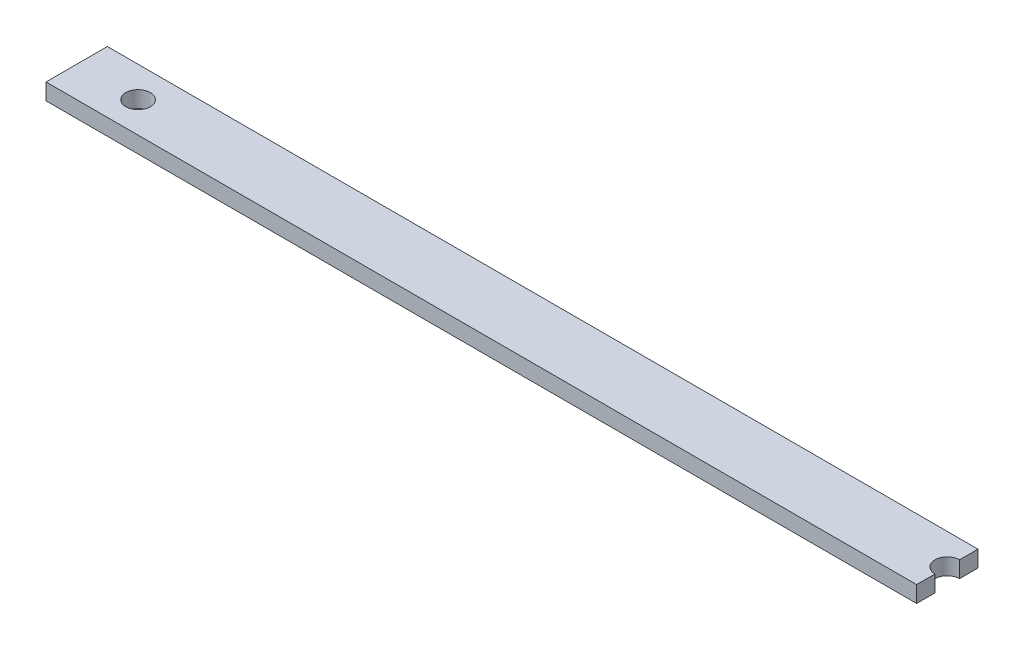
ISO-10303-21;
HEADER;
FILE_DESCRIPTION(('STEP AP214'),'2;1');
FILE_NAME('part.step','',(''),(''),'','','');
FILE_SCHEMA(('AUTOMOTIVE_DESIGN { 1 0 10303 214 1 1 1 1 }'));
ENDSEC;
DATA;
#1=APPLICATION_CONTEXT('core data for automotive mechanical design processes');
#2=APPLICATION_PROTOCOL_DEFINITION('international standard','automotive_design',2000,#1);
#3=PRODUCT_CONTEXT('',#1,'mechanical');
#4=PRODUCT('Part','Part','',(#3));
#5=PRODUCT_RELATED_PRODUCT_CATEGORY('part','',(#4));
#6=PRODUCT_DEFINITION_FORMATION('','',#4);
#7=PRODUCT_DEFINITION_CONTEXT('part definition',#1,'design');
#8=PRODUCT_DEFINITION('design','',#6,#7);
#9=PRODUCT_DEFINITION_SHAPE('','',#8);
#10=(LENGTH_UNIT() NAMED_UNIT(*) SI_UNIT(.MILLI.,.METRE.));
#11=(NAMED_UNIT(*) PLANE_ANGLE_UNIT() SI_UNIT($,.RADIAN.));
#12=(NAMED_UNIT(*) SI_UNIT($,.STERADIAN.) SOLID_ANGLE_UNIT());
#13=UNCERTAINTY_MEASURE_WITH_UNIT(LENGTH_MEASURE(1.E-05),#10,'distance_accuracy_value','');
#14=(GEOMETRIC_REPRESENTATION_CONTEXT(3) GLOBAL_UNCERTAINTY_ASSIGNED_CONTEXT((#13)) GLOBAL_UNIT_ASSIGNED_CONTEXT((#10,
#11,#12)) REPRESENTATION_CONTEXT('',''));
#15=CARTESIAN_POINT('',(0.,0.,0.));
#16=DIRECTION('',(0.,0.,1.));
#17=DIRECTION('',(1.,0.,0.));
#18=AXIS2_PLACEMENT_3D('',#15,#16,#17);
#19=CARTESIAN_POINT('',(106.37500000675,4.,7.5));
#20=DIRECTION('',(-1.,0.,0.));
#21=DIRECTION('',(0.,0.,1.));
#22=AXIS2_PLACEMENT_3D('',#19,#20,#21);
#23=PLANE('',#22);
#24=DIRECTION('',(0.,0.,-1.));
#25=VECTOR('',#24,1.);
#26=CARTESIAN_POINT('',(106.37500000675,0.,7.5));
#27=LINE('',#26,#25);
#28=CARTESIAN_POINT('',(106.37500000675,0.,7.5));
#29=VERTEX_POINT('',#28);
#30=CARTESIAN_POINT('',(106.37500000675,0.,3.00000000000001));
#31=VERTEX_POINT('',#30);
#32=EDGE_CURVE('E120',#29,#31,#27,.T.);
#33=ORIENTED_EDGE('',*,*,#32,.T.);
#34=DIRECTION('',(0.,1.,0.));
#35=VECTOR('',#34,1.);
#36=CARTESIAN_POINT('',(106.37500000675,0.,3.00000000000001));
#37=LINE('',#36,#35);
#38=CARTESIAN_POINT('',(106.37500000675,4.,3.00000000000001));
#39=VERTEX_POINT('',#38);
#40=EDGE_CURVE('E56',#31,#39,#37,.T.);
#41=ORIENTED_EDGE('',*,*,#40,.T.);
#42=DIRECTION('',(0.,0.,-1.));
#43=VECTOR('',#42,1.);
#44=CARTESIAN_POINT('',(106.37500000675,4.,7.5));
#45=LINE('',#44,#43);
#46=CARTESIAN_POINT('',(106.37500000675,4.,7.5));
#47=VERTEX_POINT('',#46);
#48=EDGE_CURVE('E155',#47,#39,#45,.T.);
#49=ORIENTED_EDGE('',*,*,#48,.F.);
#50=DIRECTION('',(0.,-1.,0.));
#51=VECTOR('',#50,1.);
#52=CARTESIAN_POINT('',(106.37500000675,4.,7.5));
#53=LINE('',#52,#51);
#54=EDGE_CURVE('E137',#47,#29,#53,.T.);
#55=ORIENTED_EDGE('',*,*,#54,.T.);
#56=EDGE_LOOP('',(#33,#41,#49,#55));
#57=FACE_BOUND('',#56,.T.);
#58=ADVANCED_FACE('F41',(#57),#23,.F.);
#59=CARTESIAN_POINT('',(106.37500000675,4.,-3.00000000000001));
#60=VERTEX_POINT('',#59);
#61=CARTESIAN_POINT('',(106.37500000675,4.,-7.5));
#62=VERTEX_POINT('',#61);
#63=EDGE_CURVE('E93',#60,#62,#45,.T.);
#64=ORIENTED_EDGE('',*,*,#63,.F.);
#65=DIRECTION('',(0.,1.,0.));
#66=VECTOR('',#65,1.);
#67=CARTESIAN_POINT('',(106.37500000675,0.,-3.00000000000001));
#68=LINE('',#67,#66);
#69=CARTESIAN_POINT('',(106.37500000675,0.,-3.00000000000001));
#70=VERTEX_POINT('',#69);
#71=EDGE_CURVE('E103',#60,#70,#68,.F.);
#72=ORIENTED_EDGE('',*,*,#71,.T.);
#73=CARTESIAN_POINT('',(106.37500000675,0.,-7.5));
#74=VERTEX_POINT('',#73);
#75=EDGE_CURVE('E110',#70,#74,#27,.T.);
#76=ORIENTED_EDGE('',*,*,#75,.T.);
#77=DIRECTION('',(0.,-1.,0.));
#78=VECTOR('',#77,1.);
#79=CARTESIAN_POINT('',(106.37500000675,4.,-7.5));
#80=LINE('',#79,#78);
#81=EDGE_CURVE('E50',#62,#74,#80,.T.);
#82=ORIENTED_EDGE('',*,*,#81,.F.);
#83=EDGE_LOOP('',(#64,#72,#76,#82));
#84=FACE_BOUND('',#83,.T.);
#85=ADVANCED_FACE('F43',(#84),#23,.F.);
#86=CARTESIAN_POINT('',(-106.37500000675,4.,-7.5));
#87=DIRECTION('',(0.,0.,1.));
#88=DIRECTION('',(1.,0.,0.));
#89=AXIS2_PLACEMENT_3D('',#86,#87,#88);
#90=PLANE('',#89);
#91=DIRECTION('',(-1.,0.,0.));
#92=VECTOR('',#91,1.);
#93=CARTESIAN_POINT('',(-106.37500000675,0.,-7.5));
#94=LINE('',#93,#92);
#95=CARTESIAN_POINT('',(-106.37500000675,0.,-7.5));
#96=VERTEX_POINT('',#95);
#97=EDGE_CURVE('E117',#74,#96,#94,.T.);
#98=ORIENTED_EDGE('',*,*,#97,.T.);
#99=DIRECTION('',(0.,-1.,0.));
#100=VECTOR('',#99,1.);
#101=CARTESIAN_POINT('',(-106.37500000675,4.,-7.5));
#102=LINE('',#101,#100);
#103=CARTESIAN_POINT('',(-106.37500000675,4.,-7.5));
#104=VERTEX_POINT('',#103);
#105=EDGE_CURVE('E143',#104,#96,#102,.T.);
#106=ORIENTED_EDGE('',*,*,#105,.F.);
#107=DIRECTION('',(-1.,0.,0.));
#108=VECTOR('',#107,1.);
#109=CARTESIAN_POINT('',(-106.37500000675,4.,-7.5));
#110=LINE('',#109,#108);
#111=EDGE_CURVE('E151',#62,#104,#110,.T.);
#112=ORIENTED_EDGE('',*,*,#111,.F.);
#113=ORIENTED_EDGE('',*,*,#81,.T.);
#114=EDGE_LOOP('',(#98,#106,#112,#113));
#115=FACE_BOUND('',#114,.T.);
#116=ADVANCED_FACE('F149',(#115),#90,.F.);
#117=CARTESIAN_POINT('',(-106.37500000675,4.,7.5));
#118=DIRECTION('',(1.,0.,0.));
#119=DIRECTION('',(0.,0.,-1.));
#120=AXIS2_PLACEMENT_3D('',#117,#118,#119);
#121=PLANE('',#120);
#122=DIRECTION('',(0.,0.,1.));
#123=VECTOR('',#122,1.);
#124=CARTESIAN_POINT('',(-106.37500000675,0.,7.5));
#125=LINE('',#124,#123);
#126=CARTESIAN_POINT('',(-106.37500000675,0.,7.5));
#127=VERTEX_POINT('',#126);
#128=EDGE_CURVE('E132',#96,#127,#125,.T.);
#129=ORIENTED_EDGE('',*,*,#128,.T.);
#130=DIRECTION('',(0.,-1.,0.));
#131=VECTOR('',#130,1.);
#132=CARTESIAN_POINT('',(-106.37500000675,4.,7.5));
#133=LINE('',#132,#131);
#134=CARTESIAN_POINT('',(-106.37500000675,4.,7.5));
#135=VERTEX_POINT('',#134);
#136=EDGE_CURVE('E140',#135,#127,#133,.T.);
#137=ORIENTED_EDGE('',*,*,#136,.F.);
#138=DIRECTION('',(0.,0.,1.));
#139=VECTOR('',#138,1.);
#140=CARTESIAN_POINT('',(-106.37500000675,4.,7.5));
#141=LINE('',#140,#139);
#142=EDGE_CURVE('E154',#104,#135,#141,.T.);
#143=ORIENTED_EDGE('',*,*,#142,.F.);
#144=ORIENTED_EDGE('',*,*,#105,.T.);
#145=EDGE_LOOP('',(#129,#137,#143,#144));
#146=FACE_BOUND('',#145,.T.);
#147=ADVANCED_FACE('F189',(#146),#121,.F.);
#148=CARTESIAN_POINT('',(-106.37500000675,4.,7.5));
#149=DIRECTION('',(0.,0.,-1.));
#150=DIRECTION('',(-1.,0.,0.));
#151=AXIS2_PLACEMENT_3D('',#148,#149,#150);
#152=PLANE('',#151);
#153=DIRECTION('',(1.,0.,0.));
#154=VECTOR('',#153,1.);
#155=CARTESIAN_POINT('',(-106.37500000675,0.,7.5));
#156=LINE('',#155,#154);
#157=EDGE_CURVE('E86',#127,#29,#156,.T.);
#158=ORIENTED_EDGE('',*,*,#157,.T.);
#159=ORIENTED_EDGE('',*,*,#54,.F.);
#160=DIRECTION('',(1.,0.,0.));
#161=VECTOR('',#160,1.);
#162=CARTESIAN_POINT('',(-106.37500000675,4.,7.5));
#163=LINE('',#162,#161);
#164=EDGE_CURVE('E65',#135,#47,#163,.T.);
#165=ORIENTED_EDGE('',*,*,#164,.F.);
#166=ORIENTED_EDGE('',*,*,#136,.T.);
#167=EDGE_LOOP('',(#158,#159,#165,#166));
#168=FACE_BOUND('',#167,.T.);
#169=ADVANCED_FACE('F183',(#168),#152,.F.);
#170=CARTESIAN_POINT('',(0.,4.,0.));
#171=DIRECTION('',(0.,-1.,0.));
#172=DIRECTION('',(0.,0.,-1.));
#173=AXIS2_PLACEMENT_3D('',#170,#171,#172);
#174=PLANE('',#173);
#175=CARTESIAN_POINT('',(-91.3750000067501,4.,0.));
#176=DIRECTION('',(0.,1.,0.));
#177=DIRECTION('',(0.,0.,1.));
#178=AXIS2_PLACEMENT_3D('',#175,#176,#177);
#179=CIRCLE('',#178,3.00000000000001);
#180=CARTESIAN_POINT('',(-91.3750000067501,4.,3.00000000000001));
#181=VERTEX_POINT('',#180);
#182=EDGE_CURVE('E165',#181,#181,#179,.T.);
#183=ORIENTED_EDGE('',*,*,#182,.F.);
#184=EDGE_LOOP('',(#183));
#185=FACE_BOUND('',#184,.T.);
#186=ORIENTED_EDGE('',*,*,#48,.T.);
#187=CARTESIAN_POINT('',(106.37500000675,4.,0.));
#188=DIRECTION('',(0.,1.,0.));
#189=DIRECTION('',(0.,0.,1.));
#190=AXIS2_PLACEMENT_3D('',#187,#188,#189);
#191=CIRCLE('',#190,3.00000000000001);
#192=EDGE_CURVE('E162',#60,#39,#191,.T.);
#193=ORIENTED_EDGE('',*,*,#192,.F.);
#194=ORIENTED_EDGE('',*,*,#63,.T.);
#195=ORIENTED_EDGE('',*,*,#111,.T.);
#196=ORIENTED_EDGE('',*,*,#142,.T.);
#197=ORIENTED_EDGE('',*,*,#164,.T.);
#198=EDGE_LOOP('',(#186,#193,#194,#195,#196,#197));
#199=FACE_BOUND('',#198,.T.);
#200=ADVANCED_FACE('F181',(#185,#199),#174,.F.);
#201=CARTESIAN_POINT('',(0.,0.,0.));
#202=DIRECTION('',(0.,-1.,0.));
#203=DIRECTION('',(0.,0.,-1.));
#204=AXIS2_PLACEMENT_3D('',#201,#202,#203);
#205=PLANE('',#204);
#206=CARTESIAN_POINT('',(-91.3750000067501,0.,0.));
#207=DIRECTION('',(0.,1.,0.));
#208=DIRECTION('',(0.,0.,1.));
#209=AXIS2_PLACEMENT_3D('',#206,#207,#208);
#210=CIRCLE('',#209,3.00000000000001);
#211=CARTESIAN_POINT('',(-91.3750000067501,0.,3.00000000000001));
#212=VERTEX_POINT('',#211);
#213=EDGE_CURVE('E113',#212,#212,#210,.T.);
#214=ORIENTED_EDGE('',*,*,#213,.T.);
#215=EDGE_LOOP('',(#214));
#216=FACE_BOUND('',#215,.T.);
#217=CARTESIAN_POINT('',(106.37500000675,0.,0.));
#218=DIRECTION('',(0.,-1.,0.));
#219=DIRECTION('',(0.,0.,-1.));
#220=AXIS2_PLACEMENT_3D('',#217,#218,#219);
#221=CIRCLE('',#220,3.00000000000001);
#222=EDGE_CURVE('E11',#31,#70,#221,.T.);
#223=ORIENTED_EDGE('',*,*,#222,.F.);
#224=ORIENTED_EDGE('',*,*,#32,.F.);
#225=ORIENTED_EDGE('',*,*,#157,.F.);
#226=ORIENTED_EDGE('',*,*,#128,.F.);
#227=ORIENTED_EDGE('',*,*,#97,.F.);
#228=ORIENTED_EDGE('',*,*,#75,.F.);
#229=EDGE_LOOP('',(#223,#224,#225,#226,#227,#228));
#230=FACE_BOUND('',#229,.T.);
#231=ADVANCED_FACE('F115',(#216,#230),#205,.T.);
#232=CARTESIAN_POINT('',(106.37500000675,0.,0.));
#233=DIRECTION('',(0.,1.,0.));
#234=DIRECTION('',(0.,0.,1.));
#235=AXIS2_PLACEMENT_3D('',#232,#233,#234);
#236=CYLINDRICAL_SURFACE('',#235,3.00000000000001);
#237=ORIENTED_EDGE('',*,*,#222,.T.);
#238=ORIENTED_EDGE('',*,*,#71,.F.);
#239=ORIENTED_EDGE('',*,*,#192,.T.);
#240=ORIENTED_EDGE('',*,*,#40,.F.);
#241=EDGE_LOOP('',(#237,#238,#239,#240));
#242=FACE_BOUND('',#241,.T.);
#243=ADVANCED_FACE('F102',(#242),#236,.F.);
#244=CARTESIAN_POINT('',(-91.3750000067501,0.,0.));
#245=DIRECTION('',(0.,1.,0.));
#246=DIRECTION('',(0.,0.,1.));
#247=AXIS2_PLACEMENT_3D('',#244,#245,#246);
#248=CYLINDRICAL_SURFACE('',#247,3.00000000000001);
#249=ORIENTED_EDGE('',*,*,#213,.F.);
#250=EDGE_LOOP('',(#249));
#251=FACE_BOUND('',#250,.T.);
#252=ORIENTED_EDGE('',*,*,#182,.T.);
#253=EDGE_LOOP('',(#252));
#254=FACE_BOUND('',#253,.T.);
#255=ADVANCED_FACE('F175',(#251,#254),#248,.F.);
#256=CLOSED_SHELL('',(#58,#85,#116,#147,#169,#200,#231,#243,#255));
#257=MANIFOLD_SOLID_BREP('B2',#256);
#258=ADVANCED_BREP_SHAPE_REPRESENTATION('',(#18,#257),#14);
#259=SHAPE_DEFINITION_REPRESENTATION(#9,#258);
ENDSEC;
END-ISO-10303-21;
